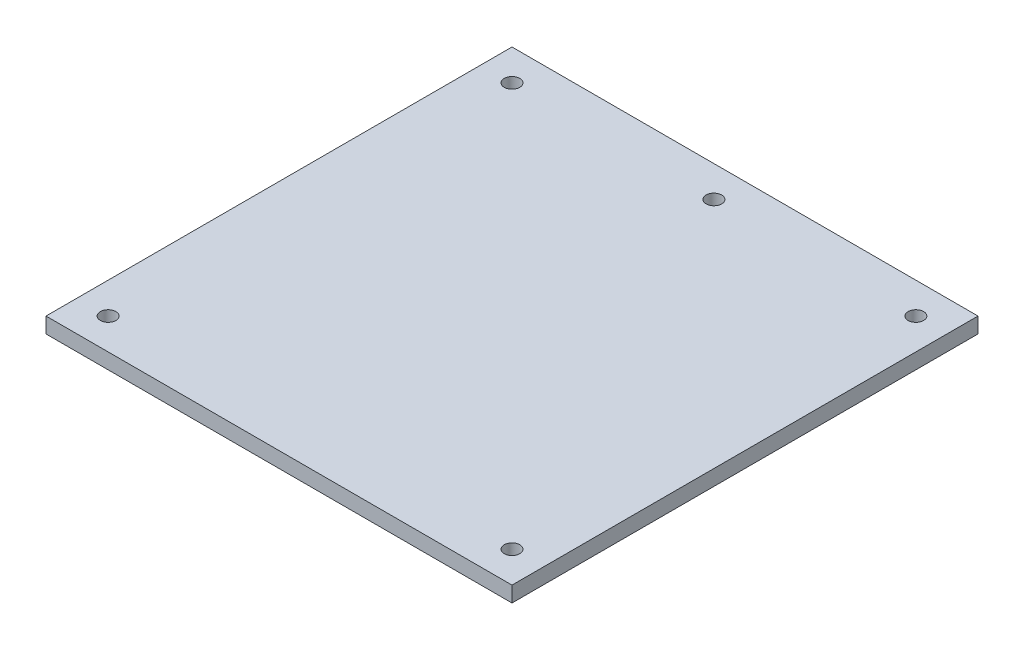
ISO-10303-21;
HEADER;
FILE_DESCRIPTION(('STEP AP214'),'2;1');
FILE_NAME('part.step','',(''),(''),'','','');
FILE_SCHEMA(('AUTOMOTIVE_DESIGN { 1 0 10303 214 1 1 1 1 }'));
ENDSEC;
DATA;
#1=APPLICATION_CONTEXT('core data for automotive mechanical design processes');
#2=APPLICATION_PROTOCOL_DEFINITION('international standard','automotive_design',2000,#1);
#3=PRODUCT_CONTEXT('',#1,'mechanical');
#4=PRODUCT('Part','Part','',(#3));
#5=PRODUCT_RELATED_PRODUCT_CATEGORY('part','',(#4));
#6=PRODUCT_DEFINITION_FORMATION('','',#4);
#7=PRODUCT_DEFINITION_CONTEXT('part definition',#1,'design');
#8=PRODUCT_DEFINITION('design','',#6,#7);
#9=PRODUCT_DEFINITION_SHAPE('','',#8);
#10=(LENGTH_UNIT() NAMED_UNIT(*) SI_UNIT(.MILLI.,.METRE.));
#11=(NAMED_UNIT(*) PLANE_ANGLE_UNIT() SI_UNIT($,.RADIAN.));
#12=(NAMED_UNIT(*) SI_UNIT($,.STERADIAN.) SOLID_ANGLE_UNIT());
#13=UNCERTAINTY_MEASURE_WITH_UNIT(LENGTH_MEASURE(1.E-05),#10,'distance_accuracy_value','');
#14=(GEOMETRIC_REPRESENTATION_CONTEXT(3) GLOBAL_UNCERTAINTY_ASSIGNED_CONTEXT((#13)) GLOBAL_UNIT_ASSIGNED_CONTEXT((#10,
#11,#12)) REPRESENTATION_CONTEXT('',''));
#15=CARTESIAN_POINT('',(0.,0.,0.));
#16=DIRECTION('',(0.,0.,1.));
#17=DIRECTION('',(1.,0.,0.));
#18=AXIS2_PLACEMENT_3D('',#15,#16,#17);
#19=CARTESIAN_POINT('',(0.,10.,0.));
#20=DIRECTION('',(0.,-1.,0.));
#21=DIRECTION('',(0.,0.,-1.));
#22=AXIS2_PLACEMENT_3D('',#19,#20,#21);
#23=PLANE('',#22);
#24=DIRECTION('',(0.,0.,1.));
#25=VECTOR('',#24,1.);
#26=CARTESIAN_POINT('',(-25.4054054054054,10.,286.351351351351));
#27=LINE('',#26,#25);
#28=CARTESIAN_POINT('',(-25.4054054054054,10.,-13.6486486486487));
#29=VERTEX_POINT('',#28);
#30=CARTESIAN_POINT('',(-25.4054054054054,10.,286.351351351351));
#31=VERTEX_POINT('',#30);
#32=EDGE_CURVE('E85',#29,#31,#27,.T.);
#33=ORIENTED_EDGE('',*,*,#32,.T.);
#34=DIRECTION('',(1.,0.,0.));
#35=VECTOR('',#34,1.);
#36=CARTESIAN_POINT('',(-25.4054054054054,10.,286.351351351351));
#37=LINE('',#36,#35);
#38=CARTESIAN_POINT('',(274.594594594595,10.,286.351351351351));
#39=VERTEX_POINT('',#38);
#40=EDGE_CURVE('E80',#31,#39,#37,.T.);
#41=ORIENTED_EDGE('',*,*,#40,.T.);
#42=DIRECTION('',(0.,0.,-1.));
#43=VECTOR('',#42,1.);
#44=CARTESIAN_POINT('',(274.594594594595,10.,286.351351351351));
#45=LINE('',#44,#43);
#46=CARTESIAN_POINT('',(274.594594594595,10.,-13.6486486486487));
#47=VERTEX_POINT('',#46);
#48=EDGE_CURVE('E83',#39,#47,#45,.T.);
#49=ORIENTED_EDGE('',*,*,#48,.T.);
#50=DIRECTION('',(-1.,0.,0.));
#51=VECTOR('',#50,1.);
#52=CARTESIAN_POINT('',(-25.4054054054054,10.,-13.6486486486487));
#53=LINE('',#52,#51);
#54=EDGE_CURVE('E50',#47,#29,#53,.T.);
#55=ORIENTED_EDGE('',*,*,#54,.T.);
#56=EDGE_LOOP('',(#33,#41,#49,#55));
#57=FACE_BOUND('',#56,.T.);
#58=CARTESIAN_POINT('',(-5.40540540540542,10.,6.35135135135135));
#59=DIRECTION('',(0.,1.,0.));
#60=DIRECTION('',(0.,0.,1.));
#61=AXIS2_PLACEMENT_3D('',#58,#59,#60);
#62=CIRCLE('',#61,5.);
#63=CARTESIAN_POINT('',(-5.40540540540542,10.,11.3513513513513));
#64=VERTEX_POINT('',#63);
#65=EDGE_CURVE('E100',#64,#64,#62,.T.);
#66=ORIENTED_EDGE('',*,*,#65,.F.);
#67=EDGE_LOOP('',(#66));
#68=FACE_BOUND('',#67,.T.);
#69=CARTESIAN_POINT('',(254.594594594595,10.,6.35135135135135));
#70=DIRECTION('',(0.,1.,0.));
#71=DIRECTION('',(0.,0.,-1.));
#72=AXIS2_PLACEMENT_3D('',#69,#70,#71);
#73=CIRCLE('',#72,5.00000000000004);
#74=CARTESIAN_POINT('',(254.594594594595,10.,1.3513513513513));
#75=VERTEX_POINT('',#74);
#76=EDGE_CURVE('E115',#75,#75,#73,.T.);
#77=ORIENTED_EDGE('',*,*,#76,.F.);
#78=EDGE_LOOP('',(#77));
#79=FACE_BOUND('',#78,.T.);
#80=CARTESIAN_POINT('',(254.594594594595,10.,266.351351351351));
#81=DIRECTION('',(0.,1.,0.));
#82=DIRECTION('',(0.,0.,1.));
#83=AXIS2_PLACEMENT_3D('',#80,#81,#82);
#84=CIRCLE('',#83,5.00000000000005);
#85=CARTESIAN_POINT('',(254.594594594595,10.,271.351351351351));
#86=VERTEX_POINT('',#85);
#87=EDGE_CURVE('E121',#86,#86,#84,.T.);
#88=ORIENTED_EDGE('',*,*,#87,.F.);
#89=EDGE_LOOP('',(#88));
#90=FACE_BOUND('',#89,.T.);
#91=CARTESIAN_POINT('',(-5.40540540540542,10.,266.351351351351));
#92=DIRECTION('',(0.,1.,0.));
#93=DIRECTION('',(0.,0.,-1.));
#94=AXIS2_PLACEMENT_3D('',#91,#92,#93);
#95=CIRCLE('',#94,5.);
#96=CARTESIAN_POINT('',(-5.40540540540542,10.,261.351351351351));
#97=VERTEX_POINT('',#96);
#98=EDGE_CURVE('E127',#97,#97,#95,.T.);
#99=ORIENTED_EDGE('',*,*,#98,.F.);
#100=EDGE_LOOP('',(#99));
#101=FACE_BOUND('',#100,.T.);
#102=CARTESIAN_POINT('',(124.594594594595,10.,6.35135135135132));
#103=DIRECTION('',(0.,1.,0.));
#104=DIRECTION('',(0.,0.,-1.));
#105=AXIS2_PLACEMENT_3D('',#102,#103,#104);
#106=CIRCLE('',#105,5.00000000000002);
#107=CARTESIAN_POINT('',(124.594594594595,10.,1.3513513513513));
#108=VERTEX_POINT('',#107);
#109=EDGE_CURVE('E133',#108,#108,#106,.T.);
#110=ORIENTED_EDGE('',*,*,#109,.F.);
#111=EDGE_LOOP('',(#110));
#112=FACE_BOUND('',#111,.T.);
#113=ADVANCED_FACE('F33',(#57,#68,#79,#90,#101,#112),#23,.F.);
#114=CARTESIAN_POINT('',(0.,0.,0.));
#115=DIRECTION('',(0.,-1.,0.));
#116=DIRECTION('',(0.,0.,-1.));
#117=AXIS2_PLACEMENT_3D('',#114,#115,#116);
#118=PLANE('',#117);
#119=CARTESIAN_POINT('',(-5.40540540540542,0.,266.351351351351));
#120=DIRECTION('',(0.,1.,0.));
#121=DIRECTION('',(0.,0.,-1.));
#122=AXIS2_PLACEMENT_3D('',#119,#120,#121);
#123=CIRCLE('',#122,5.);
#124=CARTESIAN_POINT('',(-5.40540540540542,0.,261.351351351351));
#125=VERTEX_POINT('',#124);
#126=EDGE_CURVE('E130',#125,#125,#123,.T.);
#127=ORIENTED_EDGE('',*,*,#126,.T.);
#128=EDGE_LOOP('',(#127));
#129=FACE_BOUND('',#128,.T.);
#130=CARTESIAN_POINT('',(254.594594594595,0.,6.35135135135135));
#131=DIRECTION('',(0.,1.,0.));
#132=DIRECTION('',(0.,0.,-1.));
#133=AXIS2_PLACEMENT_3D('',#130,#131,#132);
#134=CIRCLE('',#133,5.00000000000004);
#135=CARTESIAN_POINT('',(254.594594594595,0.,1.3513513513513));
#136=VERTEX_POINT('',#135);
#137=EDGE_CURVE('E118',#136,#136,#134,.T.);
#138=ORIENTED_EDGE('',*,*,#137,.T.);
#139=EDGE_LOOP('',(#138));
#140=FACE_BOUND('',#139,.T.);
#141=DIRECTION('',(0.,0.,1.));
#142=VECTOR('',#141,1.);
#143=CARTESIAN_POINT('',(-25.4054054054054,0.,286.351351351351));
#144=LINE('',#143,#142);
#145=CARTESIAN_POINT('',(-25.4054054054054,0.,-13.6486486486487));
#146=VERTEX_POINT('',#145);
#147=CARTESIAN_POINT('',(-25.4054054054054,0.,286.351351351351));
#148=VERTEX_POINT('',#147);
#149=EDGE_CURVE('E97',#146,#148,#144,.T.);
#150=ORIENTED_EDGE('',*,*,#149,.F.);
#151=DIRECTION('',(-1.,0.,0.));
#152=VECTOR('',#151,1.);
#153=CARTESIAN_POINT('',(-25.4054054054054,0.,-13.6486486486487));
#154=LINE('',#153,#152);
#155=CARTESIAN_POINT('',(274.594594594595,0.,-13.6486486486487));
#156=VERTEX_POINT('',#155);
#157=EDGE_CURVE('E73',#156,#146,#154,.T.);
#158=ORIENTED_EDGE('',*,*,#157,.F.);
#159=DIRECTION('',(0.,0.,-1.));
#160=VECTOR('',#159,1.);
#161=CARTESIAN_POINT('',(274.594594594595,0.,286.351351351351));
#162=LINE('',#161,#160);
#163=CARTESIAN_POINT('',(274.594594594595,0.,286.351351351351));
#164=VERTEX_POINT('',#163);
#165=EDGE_CURVE('E67',#164,#156,#162,.T.);
#166=ORIENTED_EDGE('',*,*,#165,.F.);
#167=DIRECTION('',(1.,0.,0.));
#168=VECTOR('',#167,1.);
#169=CARTESIAN_POINT('',(-25.4054054054054,0.,286.351351351351));
#170=LINE('',#169,#168);
#171=EDGE_CURVE('E89',#148,#164,#170,.T.);
#172=ORIENTED_EDGE('',*,*,#171,.F.);
#173=EDGE_LOOP('',(#150,#158,#166,#172));
#174=FACE_BOUND('',#173,.T.);
#175=CARTESIAN_POINT('',(-5.40540540540542,0.,6.35135135135135));
#176=DIRECTION('',(0.,1.,0.));
#177=DIRECTION('',(0.,0.,1.));
#178=AXIS2_PLACEMENT_3D('',#175,#176,#177);
#179=CIRCLE('',#178,5.);
#180=CARTESIAN_POINT('',(-5.40540540540542,0.,11.3513513513513));
#181=VERTEX_POINT('',#180);
#182=EDGE_CURVE('E112',#181,#181,#179,.T.);
#183=ORIENTED_EDGE('',*,*,#182,.T.);
#184=EDGE_LOOP('',(#183));
#185=FACE_BOUND('',#184,.T.);
#186=CARTESIAN_POINT('',(254.594594594595,0.,266.351351351351));
#187=DIRECTION('',(0.,1.,0.));
#188=DIRECTION('',(0.,0.,1.));
#189=AXIS2_PLACEMENT_3D('',#186,#187,#188);
#190=CIRCLE('',#189,5.00000000000005);
#191=CARTESIAN_POINT('',(254.594594594595,0.,271.351351351351));
#192=VERTEX_POINT('',#191);
#193=EDGE_CURVE('E124',#192,#192,#190,.T.);
#194=ORIENTED_EDGE('',*,*,#193,.T.);
#195=EDGE_LOOP('',(#194));
#196=FACE_BOUND('',#195,.T.);
#197=CARTESIAN_POINT('',(124.594594594595,0.,6.35135135135132));
#198=DIRECTION('',(0.,1.,0.));
#199=DIRECTION('',(0.,0.,-1.));
#200=AXIS2_PLACEMENT_3D('',#197,#198,#199);
#201=CIRCLE('',#200,5.00000000000002);
#202=CARTESIAN_POINT('',(124.594594594595,0.,1.3513513513513));
#203=VERTEX_POINT('',#202);
#204=EDGE_CURVE('E136',#203,#203,#201,.T.);
#205=ORIENTED_EDGE('',*,*,#204,.T.);
#206=EDGE_LOOP('',(#205));
#207=FACE_BOUND('',#206,.T.);
#208=ADVANCED_FACE('F108',(#129,#140,#174,#185,#196,#207),#118,.T.);
#209=CARTESIAN_POINT('',(-25.4054054054054,10.,286.351351351351));
#210=DIRECTION('',(1.,0.,0.));
#211=DIRECTION('',(0.,0.,-1.));
#212=AXIS2_PLACEMENT_3D('',#209,#210,#211);
#213=PLANE('',#212);
#214=ORIENTED_EDGE('',*,*,#149,.T.);
#215=DIRECTION('',(0.,-1.,0.));
#216=VECTOR('',#215,1.);
#217=CARTESIAN_POINT('',(-25.4054054054054,10.,286.351351351351));
#218=LINE('',#217,#216);
#219=EDGE_CURVE('E11',#31,#148,#218,.T.);
#220=ORIENTED_EDGE('',*,*,#219,.F.);
#221=ORIENTED_EDGE('',*,*,#32,.F.);
#222=DIRECTION('',(0.,-1.,0.));
#223=VECTOR('',#222,1.);
#224=CARTESIAN_POINT('',(-25.4054054054054,10.,-13.6486486486487));
#225=LINE('',#224,#223);
#226=EDGE_CURVE('E93',#29,#146,#225,.T.);
#227=ORIENTED_EDGE('',*,*,#226,.T.);
#228=EDGE_LOOP('',(#214,#220,#221,#227));
#229=FACE_BOUND('',#228,.T.);
#230=ADVANCED_FACE('F35',(#229),#213,.F.);
#231=CARTESIAN_POINT('',(-25.4054054054054,10.,286.351351351351));
#232=DIRECTION('',(0.,0.,-1.));
#233=DIRECTION('',(-1.,0.,0.));
#234=AXIS2_PLACEMENT_3D('',#231,#232,#233);
#235=PLANE('',#234);
#236=ORIENTED_EDGE('',*,*,#171,.T.);
#237=DIRECTION('',(0.,-1.,0.));
#238=VECTOR('',#237,1.);
#239=CARTESIAN_POINT('',(274.594594594595,10.,286.351351351351));
#240=LINE('',#239,#238);
#241=EDGE_CURVE('E42',#39,#164,#240,.T.);
#242=ORIENTED_EDGE('',*,*,#241,.F.);
#243=ORIENTED_EDGE('',*,*,#40,.F.);
#244=ORIENTED_EDGE('',*,*,#219,.T.);
#245=EDGE_LOOP('',(#236,#242,#243,#244));
#246=FACE_BOUND('',#245,.T.);
#247=ADVANCED_FACE('F88',(#246),#235,.F.);
#248=CARTESIAN_POINT('',(274.594594594595,10.,286.351351351351));
#249=DIRECTION('',(-1.,0.,0.));
#250=DIRECTION('',(0.,0.,1.));
#251=AXIS2_PLACEMENT_3D('',#248,#249,#250);
#252=PLANE('',#251);
#253=ORIENTED_EDGE('',*,*,#165,.T.);
#254=DIRECTION('',(0.,-1.,0.));
#255=VECTOR('',#254,1.);
#256=CARTESIAN_POINT('',(274.594594594595,10.,-13.6486486486487));
#257=LINE('',#256,#255);
#258=EDGE_CURVE('E90',#47,#156,#257,.T.);
#259=ORIENTED_EDGE('',*,*,#258,.F.);
#260=ORIENTED_EDGE('',*,*,#48,.F.);
#261=ORIENTED_EDGE('',*,*,#241,.T.);
#262=EDGE_LOOP('',(#253,#259,#260,#261));
#263=FACE_BOUND('',#262,.T.);
#264=ADVANCED_FACE('F91',(#263),#252,.F.);
#265=CARTESIAN_POINT('',(-25.4054054054054,10.,-13.6486486486487));
#266=DIRECTION('',(0.,0.,1.));
#267=DIRECTION('',(1.,0.,0.));
#268=AXIS2_PLACEMENT_3D('',#265,#266,#267);
#269=PLANE('',#268);
#270=ORIENTED_EDGE('',*,*,#157,.T.);
#271=ORIENTED_EDGE('',*,*,#226,.F.);
#272=ORIENTED_EDGE('',*,*,#54,.F.);
#273=ORIENTED_EDGE('',*,*,#258,.T.);
#274=EDGE_LOOP('',(#270,#271,#272,#273));
#275=FACE_BOUND('',#274,.T.);
#276=ADVANCED_FACE('F105',(#275),#269,.F.);
#277=CARTESIAN_POINT('',(-5.40540540540542,10.,6.35135135135135));
#278=DIRECTION('',(0.,-1.,0.));
#279=DIRECTION('',(0.,0.,-1.));
#280=AXIS2_PLACEMENT_3D('',#277,#278,#279);
#281=CYLINDRICAL_SURFACE('',#280,5.);
#282=ORIENTED_EDGE('',*,*,#65,.T.);
#283=EDGE_LOOP('',(#282));
#284=FACE_BOUND('',#283,.T.);
#285=ORIENTED_EDGE('',*,*,#182,.F.);
#286=EDGE_LOOP('',(#285));
#287=FACE_BOUND('',#286,.T.);
#288=ADVANCED_FACE('F153',(#284,#287),#281,.F.);
#289=CARTESIAN_POINT('',(254.594594594595,10.,6.35135135135135));
#290=DIRECTION('',(0.,-1.,0.));
#291=DIRECTION('',(0.,0.,-1.));
#292=AXIS2_PLACEMENT_3D('',#289,#290,#291);
#293=CYLINDRICAL_SURFACE('',#292,5.00000000000004);
#294=ORIENTED_EDGE('',*,*,#76,.T.);
#295=EDGE_LOOP('',(#294));
#296=FACE_BOUND('',#295,.T.);
#297=ORIENTED_EDGE('',*,*,#137,.F.);
#298=EDGE_LOOP('',(#297));
#299=FACE_BOUND('',#298,.T.);
#300=ADVANCED_FACE('F199',(#296,#299),#293,.F.);
#301=CARTESIAN_POINT('',(254.594594594595,10.,266.351351351351));
#302=DIRECTION('',(0.,-1.,0.));
#303=DIRECTION('',(0.,0.,-1.));
#304=AXIS2_PLACEMENT_3D('',#301,#302,#303);
#305=CYLINDRICAL_SURFACE('',#304,5.00000000000005);
#306=ORIENTED_EDGE('',*,*,#87,.T.);
#307=EDGE_LOOP('',(#306));
#308=FACE_BOUND('',#307,.T.);
#309=ORIENTED_EDGE('',*,*,#193,.F.);
#310=EDGE_LOOP('',(#309));
#311=FACE_BOUND('',#310,.T.);
#312=ADVANCED_FACE('F207',(#308,#311),#305,.F.);
#313=CARTESIAN_POINT('',(-5.40540540540542,10.,266.351351351351));
#314=DIRECTION('',(0.,-1.,0.));
#315=DIRECTION('',(0.,0.,-1.));
#316=AXIS2_PLACEMENT_3D('',#313,#314,#315);
#317=CYLINDRICAL_SURFACE('',#316,5.);
#318=ORIENTED_EDGE('',*,*,#98,.T.);
#319=EDGE_LOOP('',(#318));
#320=FACE_BOUND('',#319,.T.);
#321=ORIENTED_EDGE('',*,*,#126,.F.);
#322=EDGE_LOOP('',(#321));
#323=FACE_BOUND('',#322,.T.);
#324=ADVANCED_FACE('F215',(#320,#323),#317,.F.);
#325=CARTESIAN_POINT('',(124.594594594595,10.,6.35135135135132));
#326=DIRECTION('',(0.,-1.,0.));
#327=DIRECTION('',(0.,0.,-1.));
#328=AXIS2_PLACEMENT_3D('',#325,#326,#327);
#329=CYLINDRICAL_SURFACE('',#328,5.00000000000002);
#330=ORIENTED_EDGE('',*,*,#109,.T.);
#331=EDGE_LOOP('',(#330));
#332=FACE_BOUND('',#331,.T.);
#333=ORIENTED_EDGE('',*,*,#204,.F.);
#334=EDGE_LOOP('',(#333));
#335=FACE_BOUND('',#334,.T.);
#336=ADVANCED_FACE('F142',(#332,#335),#329,.F.);
#337=CLOSED_SHELL('',(#113,#208,#230,#247,#264,#276,#288,#300,#312,#324,#336));
#338=MANIFOLD_SOLID_BREP('B2',#337);
#339=ADVANCED_BREP_SHAPE_REPRESENTATION('',(#18,#338),#14);
#340=SHAPE_DEFINITION_REPRESENTATION(#9,#339);
ENDSEC;
END-ISO-10303-21;
